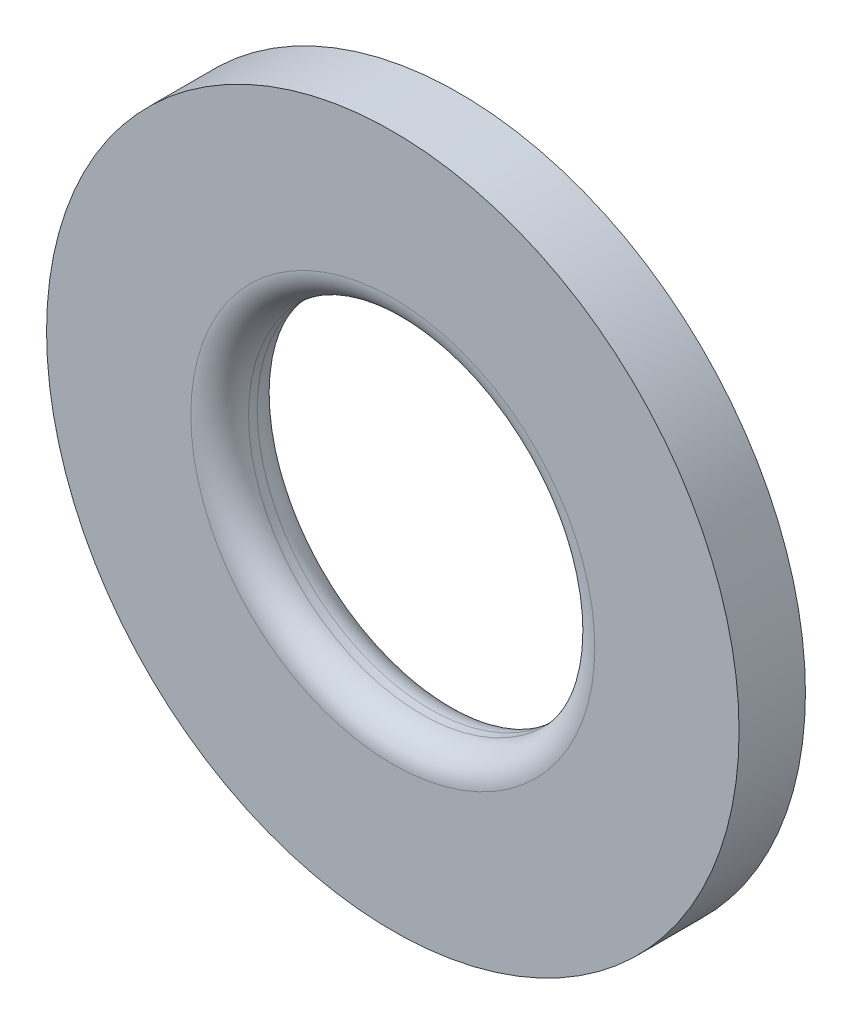
ISO-10303-21;
HEADER;
FILE_DESCRIPTION(('STEP AP214'),'2;1');
FILE_NAME('part.step','',(''),(''),'','','');
FILE_SCHEMA(('AUTOMOTIVE_DESIGN { 1 0 10303 214 1 1 1 1 }'));
ENDSEC;
DATA;
#1=APPLICATION_CONTEXT('core data for automotive mechanical design processes');
#2=APPLICATION_PROTOCOL_DEFINITION('international standard','automotive_design',2000,#1);
#3=PRODUCT_CONTEXT('',#1,'mechanical');
#4=PRODUCT('Part','Part','',(#3));
#5=PRODUCT_RELATED_PRODUCT_CATEGORY('part','',(#4));
#6=PRODUCT_DEFINITION_FORMATION('','',#4);
#7=PRODUCT_DEFINITION_CONTEXT('part definition',#1,'design');
#8=PRODUCT_DEFINITION('design','',#6,#7);
#9=PRODUCT_DEFINITION_SHAPE('','',#8);
#10=(LENGTH_UNIT() NAMED_UNIT(*) SI_UNIT(.MILLI.,.METRE.));
#11=(NAMED_UNIT(*) PLANE_ANGLE_UNIT() SI_UNIT($,.RADIAN.));
#12=(NAMED_UNIT(*) SI_UNIT($,.STERADIAN.) SOLID_ANGLE_UNIT());
#13=UNCERTAINTY_MEASURE_WITH_UNIT(LENGTH_MEASURE(1.E-05),#10,'distance_accuracy_value','');
#14=(GEOMETRIC_REPRESENTATION_CONTEXT(3) GLOBAL_UNCERTAINTY_ASSIGNED_CONTEXT((#13)) GLOBAL_UNIT_ASSIGNED_CONTEXT((#10,
#11,#12)) REPRESENTATION_CONTEXT('',''));
#15=CARTESIAN_POINT('',(0.,0.,0.));
#16=DIRECTION('',(0.,0.,1.));
#17=DIRECTION('',(1.,0.,0.));
#18=AXIS2_PLACEMENT_3D('',#15,#16,#17);
#19=CARTESIAN_POINT('',(0.,0.,2.3));
#20=DIRECTION('',(0.,0.,1.));
#21=DIRECTION('',(1.,0.,0.));
#22=AXIS2_PLACEMENT_3D('',#19,#20,#21);
#23=PLANE('',#22);
#24=CARTESIAN_POINT('',(0.,0.,2.3));
#25=DIRECTION('',(0.,0.,1.));
#26=DIRECTION('',(1.,0.,0.));
#27=AXIS2_PLACEMENT_3D('',#24,#25,#26);
#28=CIRCLE('',#27,7.);
#29=CARTESIAN_POINT('',(7.,0.,2.3));
#30=VERTEX_POINT('',#29);
#31=EDGE_CURVE('E10',#30,#30,#28,.F.);
#32=ORIENTED_EDGE('',*,*,#31,.T.);
#33=EDGE_LOOP('',(#32));
#34=FACE_BOUND('',#33,.T.);
#35=CARTESIAN_POINT('',(0.,0.,2.3));
#36=DIRECTION('',(0.,0.,1.));
#37=DIRECTION('',(1.,0.,0.));
#38=AXIS2_PLACEMENT_3D('',#35,#36,#37);
#39=CIRCLE('',#38,12.);
#40=CARTESIAN_POINT('',(12.,0.,2.3));
#41=VERTEX_POINT('',#40);
#42=EDGE_CURVE('E53',#41,#41,#39,.T.);
#43=ORIENTED_EDGE('',*,*,#42,.T.);
#44=EDGE_LOOP('',(#43));
#45=FACE_BOUND('',#44,.T.);
#46=ADVANCED_FACE('F33',(#34,#45),#23,.T.);
#47=CARTESIAN_POINT('',(0.,0.,0.));
#48=DIRECTION('',(0.,0.,1.));
#49=DIRECTION('',(1.,0.,0.));
#50=AXIS2_PLACEMENT_3D('',#47,#48,#49);
#51=PLANE('',#50);
#52=CARTESIAN_POINT('',(0.,0.,0.));
#53=DIRECTION('',(0.,0.,1.));
#54=DIRECTION('',(1.,0.,0.));
#55=AXIS2_PLACEMENT_3D('',#52,#53,#54);
#56=CIRCLE('',#55,7.);
#57=CARTESIAN_POINT('',(7.,0.,0.));
#58=VERTEX_POINT('',#57);
#59=EDGE_CURVE('E48',#58,#58,#56,.T.);
#60=ORIENTED_EDGE('',*,*,#59,.T.);
#61=EDGE_LOOP('',(#60));
#62=FACE_BOUND('',#61,.T.);
#63=CARTESIAN_POINT('',(0.,0.,0.));
#64=DIRECTION('',(0.,0.,1.));
#65=DIRECTION('',(1.,0.,0.));
#66=AXIS2_PLACEMENT_3D('',#63,#64,#65);
#67=CIRCLE('',#66,12.);
#68=CARTESIAN_POINT('',(12.,0.,0.));
#69=VERTEX_POINT('',#68);
#70=EDGE_CURVE('E54',#69,#69,#67,.T.);
#71=ORIENTED_EDGE('',*,*,#70,.F.);
#72=EDGE_LOOP('',(#71));
#73=FACE_BOUND('',#72,.T.);
#74=ADVANCED_FACE('F65',(#62,#73),#51,.F.);
#75=CARTESIAN_POINT('',(0.,0.,2.3));
#76=DIRECTION('',(0.,0.,-1.));
#77=DIRECTION('',(-1.,0.,0.));
#78=AXIS2_PLACEMENT_3D('',#75,#76,#77);
#79=CYLINDRICAL_SURFACE('',#78,12.);
#80=ORIENTED_EDGE('',*,*,#42,.F.);
#81=EDGE_LOOP('',(#80));
#82=FACE_BOUND('',#81,.T.);
#83=ORIENTED_EDGE('',*,*,#70,.T.);
#84=EDGE_LOOP('',(#83));
#85=FACE_BOUND('',#84,.T.);
#86=ADVANCED_FACE('F61',(#82,#85),#79,.T.);
#87=CARTESIAN_POINT('',(0.,0.,2.3));
#88=DIRECTION('',(0.,0.,-1.));
#89=DIRECTION('',(-1.,0.,0.));
#90=AXIS2_PLACEMENT_3D('',#87,#88,#89);
#91=CYLINDRICAL_SURFACE('',#90,6.);
#92=CARTESIAN_POINT('',(0.,0.,1.));
#93=DIRECTION('',(0.,0.,1.));
#94=DIRECTION('',(1.,0.,0.));
#95=AXIS2_PLACEMENT_3D('',#92,#93,#94);
#96=CIRCLE('',#95,6.);
#97=CARTESIAN_POINT('',(6.,0.,1.));
#98=VERTEX_POINT('',#97);
#99=EDGE_CURVE('E40',#98,#98,#96,.F.);
#100=ORIENTED_EDGE('',*,*,#99,.T.);
#101=EDGE_LOOP('',(#100));
#102=FACE_BOUND('',#101,.T.);
#103=CARTESIAN_POINT('',(0.,0.,1.3));
#104=DIRECTION('',(0.,0.,1.));
#105=DIRECTION('',(1.,0.,0.));
#106=AXIS2_PLACEMENT_3D('',#103,#104,#105);
#107=CIRCLE('',#106,6.);
#108=CARTESIAN_POINT('',(6.,0.,1.3));
#109=VERTEX_POINT('',#108);
#110=EDGE_CURVE('E44',#109,#109,#107,.T.);
#111=ORIENTED_EDGE('',*,*,#110,.T.);
#112=EDGE_LOOP('',(#111));
#113=FACE_BOUND('',#112,.T.);
#114=ADVANCED_FACE('F64',(#102,#113),#91,.F.);
#115=CARTESIAN_POINT('',(0.,0.,1.));
#116=DIRECTION('',(0.,0.,1.));
#117=DIRECTION('',(1.,0.,0.));
#118=AXIS2_PLACEMENT_3D('',#115,#116,#117);
#119=TOROIDAL_SURFACE('',#118,7.,1.);
#120=ORIENTED_EDGE('',*,*,#99,.F.);
#121=EDGE_LOOP('',(#120));
#122=FACE_BOUND('',#121,.T.);
#123=ORIENTED_EDGE('',*,*,#59,.F.);
#124=EDGE_LOOP('',(#123));
#125=FACE_BOUND('',#124,.T.);
#126=ADVANCED_FACE('F77',(#122,#125),#119,.T.);
#127=CARTESIAN_POINT('',(0.,0.,1.3));
#128=DIRECTION('',(0.,0.,1.));
#129=DIRECTION('',(1.,0.,0.));
#130=AXIS2_PLACEMENT_3D('',#127,#128,#129);
#131=TOROIDAL_SURFACE('',#130,7.,1.);
#132=ORIENTED_EDGE('',*,*,#31,.F.);
#133=EDGE_LOOP('',(#132));
#134=FACE_BOUND('',#133,.T.);
#135=ORIENTED_EDGE('',*,*,#110,.F.);
#136=EDGE_LOOP('',(#135));
#137=FACE_BOUND('',#136,.T.);
#138=ADVANCED_FACE('F35',(#134,#137),#131,.T.);
#139=CLOSED_SHELL('',(#46,#74,#86,#114,#126,#138));
#140=MANIFOLD_SOLID_BREP('B2',#139);
#141=ADVANCED_BREP_SHAPE_REPRESENTATION('',(#18,#140),#14);
#142=SHAPE_DEFINITION_REPRESENTATION(#9,#141);
ENDSEC;
END-ISO-10303-21;
